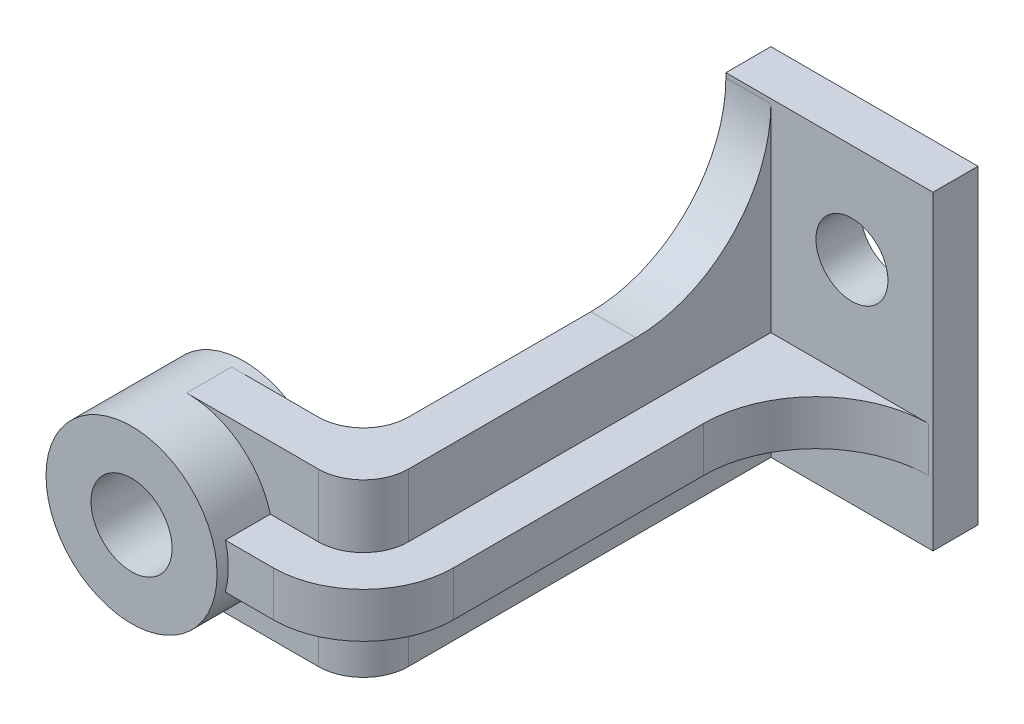
ISO-10303-21;
HEADER;
FILE_DESCRIPTION(('STEP AP214'),'2;1');
FILE_NAME('part.step','',(''),(''),'','','');
FILE_SCHEMA(('AUTOMOTIVE_DESIGN { 1 0 10303 214 1 1 1 1 }'));
ENDSEC;
DATA;
#1=APPLICATION_CONTEXT('core data for automotive mechanical design processes');
#2=APPLICATION_PROTOCOL_DEFINITION('international standard','automotive_design',2000,#1);
#3=PRODUCT_CONTEXT('',#1,'mechanical');
#4=PRODUCT('Part','Part','',(#3));
#5=PRODUCT_RELATED_PRODUCT_CATEGORY('part','',(#4));
#6=PRODUCT_DEFINITION_FORMATION('','',#4);
#7=PRODUCT_DEFINITION_CONTEXT('part definition',#1,'design');
#8=PRODUCT_DEFINITION('design','',#6,#7);
#9=PRODUCT_DEFINITION_SHAPE('','',#8);
#10=(LENGTH_UNIT() NAMED_UNIT(*) SI_UNIT(.MILLI.,.METRE.));
#11=(NAMED_UNIT(*) PLANE_ANGLE_UNIT() SI_UNIT($,.RADIAN.));
#12=(NAMED_UNIT(*) SI_UNIT($,.STERADIAN.) SOLID_ANGLE_UNIT());
#13=UNCERTAINTY_MEASURE_WITH_UNIT(LENGTH_MEASURE(1.E-05),#10,'distance_accuracy_value','');
#14=(GEOMETRIC_REPRESENTATION_CONTEXT(3) GLOBAL_UNCERTAINTY_ASSIGNED_CONTEXT((#13)) GLOBAL_UNIT_ASSIGNED_CONTEXT((#10,
#11,#12)) REPRESENTATION_CONTEXT('',''));
#15=CARTESIAN_POINT('',(0.,0.,0.));
#16=DIRECTION('',(0.,0.,1.));
#17=DIRECTION('',(1.,0.,0.));
#18=AXIS2_PLACEMENT_3D('',#15,#16,#17);
#19=CARTESIAN_POINT('',(-52.2741331242888,-34.5,100.5));
#20=DIRECTION('',(0.,0.,-1.));
#21=DIRECTION('',(-1.,0.,0.));
#22=AXIS2_PLACEMENT_3D('',#19,#20,#21);
#23=PLANE('',#22);
#24=DIRECTION('',(-1.,0.,0.));
#25=VECTOR('',#24,1.);
#26=CARTESIAN_POINT('',(-52.2741331242888,-10.5,100.5));
#27=LINE('',#26,#25);
#28=CARTESIAN_POINT('',(-23.,-10.5,100.5));
#29=VERTEX_POINT('',#28);
#30=CARTESIAN_POINT('',(-33.6696972201766,-10.5,100.5));
#31=VERTEX_POINT('',#30);
#32=EDGE_CURVE('E258',#29,#31,#27,.T.);
#33=ORIENTED_EDGE('',*,*,#32,.F.);
#34=DIRECTION('',(0.,1.,0.));
#35=VECTOR('',#34,1.);
#36=CARTESIAN_POINT('',(-23.,-34.5,100.5));
#37=LINE('',#36,#35);
#38=CARTESIAN_POINT('',(-23.,3.5,100.5));
#39=VERTEX_POINT('',#38);
#40=EDGE_CURVE('E399',#29,#39,#37,.T.);
#41=ORIENTED_EDGE('',*,*,#40,.T.);
#42=DIRECTION('',(-1.,0.,0.));
#43=VECTOR('',#42,1.);
#44=CARTESIAN_POINT('',(-52.2741331242888,3.5,100.5));
#45=LINE('',#44,#43);
#46=CARTESIAN_POINT('',(-52.,3.5,100.5));
#47=VERTEX_POINT('',#46);
#48=EDGE_CURVE('E326',#39,#47,#45,.T.);
#49=ORIENTED_EDGE('',*,*,#48,.T.);
#50=CARTESIAN_POINT('',(-52.,-15.5,100.5));
#51=DIRECTION('',(0.,0.,-1.));
#52=DIRECTION('',(-1.,0.,0.));
#53=AXIS2_PLACEMENT_3D('',#50,#51,#52);
#54=CIRCLE('',#53,19.);
#55=EDGE_CURVE('E294',#31,#47,#54,.F.);
#56=ORIENTED_EDGE('',*,*,#55,.F.);
#57=EDGE_LOOP('',(#33,#41,#49,#56));
#58=FACE_BOUND('',#57,.T.);
#59=ADVANCED_FACE('F39',(#58),#23,.F.);
#60=CARTESIAN_POINT('',(-13.,-34.5,100.5));
#61=DIRECTION('',(-1.,0.,0.));
#62=DIRECTION('',(0.,0.,1.));
#63=AXIS2_PLACEMENT_3D('',#60,#61,#62);
#64=PLANE('',#63);
#65=DIRECTION('',(0.,0.,1.));
#66=VECTOR('',#65,1.);
#67=CARTESIAN_POINT('',(-13.,-10.5,100.5));
#68=LINE('',#67,#66);
#69=CARTESIAN_POINT('',(-13.,-10.5,9.99999999999999));
#70=VERTEX_POINT('',#69);
#71=CARTESIAN_POINT('',(-13.,-10.5,90.5));
#72=VERTEX_POINT('',#71);
#73=EDGE_CURVE('E255',#70,#72,#68,.T.);
#74=ORIENTED_EDGE('',*,*,#73,.F.);
#75=DIRECTION('',(0.,1.,0.));
#76=VECTOR('',#75,1.);
#77=CARTESIAN_POINT('',(-13.,-34.5,10.));
#78=LINE('',#77,#76);
#79=CARTESIAN_POINT('',(-13.,33.5,10.));
#80=VERTEX_POINT('',#79);
#81=EDGE_CURVE('E345',#70,#80,#78,.T.);
#82=ORIENTED_EDGE('',*,*,#81,.T.);
#83=CARTESIAN_POINT('',(-13.,33.5,40.));
#84=DIRECTION('',(-1.,0.,0.));
#85=DIRECTION('',(0.,0.,1.));
#86=AXIS2_PLACEMENT_3D('',#83,#84,#85);
#87=CIRCLE('',#86,30.);
#88=CARTESIAN_POINT('',(-13.,3.5,40.));
#89=VERTEX_POINT('',#88);
#90=EDGE_CURVE('E388',#80,#89,#87,.T.);
#91=ORIENTED_EDGE('',*,*,#90,.T.);
#92=DIRECTION('',(0.,0.,1.));
#93=VECTOR('',#92,1.);
#94=CARTESIAN_POINT('',(-13.,3.5,100.5));
#95=LINE('',#94,#93);
#96=CARTESIAN_POINT('',(-13.,3.5,90.5));
#97=VERTEX_POINT('',#96);
#98=EDGE_CURVE('E308',#89,#97,#95,.T.);
#99=ORIENTED_EDGE('',*,*,#98,.T.);
#100=DIRECTION('',(0.,1.,0.));
#101=VECTOR('',#100,1.);
#102=CARTESIAN_POINT('',(-13.,-34.5,90.5));
#103=LINE('',#102,#101);
#104=EDGE_CURVE('E406',#97,#72,#103,.F.);
#105=ORIENTED_EDGE('',*,*,#104,.T.);
#106=EDGE_LOOP('',(#74,#82,#91,#99,#105));
#107=FACE_BOUND('',#106,.T.);
#108=ADVANCED_FACE('F504',(#107),#64,.F.);
#109=CARTESIAN_POINT('',(-23.,-34.5,90.5));
#110=DIRECTION('',(0.,1.,0.));
#111=DIRECTION('',(0.,0.,1.));
#112=AXIS2_PLACEMENT_3D('',#109,#110,#111);
#113=CYLINDRICAL_SURFACE('',#112,10.);
#114=ORIENTED_EDGE('',*,*,#40,.F.);
#115=CARTESIAN_POINT('',(-23.,-10.5,90.5));
#116=DIRECTION('',(0.,-1.,0.));
#117=DIRECTION('',(0.,0.,-1.));
#118=AXIS2_PLACEMENT_3D('',#115,#116,#117);
#119=CIRCLE('',#118,10.);
#120=EDGE_CURVE('E415',#29,#72,#119,.F.);
#121=ORIENTED_EDGE('',*,*,#120,.T.);
#122=ORIENTED_EDGE('',*,*,#104,.F.);
#123=CARTESIAN_POINT('',(-23.,3.5,90.5));
#124=DIRECTION('',(0.,1.,0.));
#125=DIRECTION('',(0.,0.,1.));
#126=AXIS2_PLACEMENT_3D('',#123,#124,#125);
#127=CIRCLE('',#126,10.);
#128=EDGE_CURVE('E403',#39,#97,#127,.T.);
#129=ORIENTED_EDGE('',*,*,#128,.F.);
#130=EDGE_LOOP('',(#114,#121,#122,#129));
#131=FACE_BOUND('',#130,.T.);
#132=ADVANCED_FACE('F510',(#131),#113,.T.);
#133=CARTESIAN_POINT('',(-23.,-34.5,90.5));
#134=DIRECTION('',(0.,0.,1.));
#135=DIRECTION('',(1.,0.,0.));
#136=AXIS2_PLACEMENT_3D('',#133,#134,#135);
#137=PLANE('',#136);
#138=DIRECTION('',(0.,1.,0.));
#139=VECTOR('',#138,1.);
#140=CARTESIAN_POINT('',(-33.,-34.5,90.5));
#141=LINE('',#140,#139);
#142=CARTESIAN_POINT('',(-33.,3.5,90.5));
#143=VERTEX_POINT('',#142);
#144=CARTESIAN_POINT('',(-33.,-15.5,90.5));
#145=VERTEX_POINT('',#144);
#146=EDGE_CURVE('E396',#143,#145,#141,.F.);
#147=ORIENTED_EDGE('',*,*,#146,.T.);
#148=CARTESIAN_POINT('',(-52.,-15.5,90.5));
#149=DIRECTION('',(0.,0.,1.));
#150=DIRECTION('',(1.,0.,0.));
#151=AXIS2_PLACEMENT_3D('',#148,#149,#150);
#152=CIRCLE('',#151,19.);
#153=CARTESIAN_POINT('',(-52.,3.5,90.5));
#154=VERTEX_POINT('',#153);
#155=EDGE_CURVE('E284',#154,#145,#152,.F.);
#156=ORIENTED_EDGE('',*,*,#155,.F.);
#157=DIRECTION('',(1.,0.,0.));
#158=VECTOR('',#157,1.);
#159=CARTESIAN_POINT('',(-23.,3.5,90.5));
#160=LINE('',#159,#158);
#161=EDGE_CURVE('E332',#154,#143,#160,.T.);
#162=ORIENTED_EDGE('',*,*,#161,.T.);
#163=EDGE_LOOP('',(#147,#156,#162));
#164=FACE_BOUND('',#163,.T.);
#165=ADVANCED_FACE('F524',(#164),#137,.F.);
#166=CARTESIAN_POINT('',(-52.2741331242888,-34.4980222926011,100.5));
#167=VERTEX_POINT('',#166);
#168=CARTESIAN_POINT('',(-52.,-34.5,100.5));
#169=VERTEX_POINT('',#168);
#170=EDGE_CURVE('E293',#167,#169,#54,.F.);
#171=ORIENTED_EDGE('',*,*,#170,.F.);
#172=DIRECTION('',(0.,1.,0.));
#173=VECTOR('',#172,1.);
#174=CARTESIAN_POINT('',(-52.2741331242888,-34.5,100.5));
#175=LINE('',#174,#173);
#176=CARTESIAN_POINT('',(-52.2741331242888,-34.5,100.5));
#177=VERTEX_POINT('',#176);
#178=EDGE_CURVE('E342',#177,#167,#175,.T.);
#179=ORIENTED_EDGE('',*,*,#178,.F.);
#180=DIRECTION('',(-1.,0.,0.));
#181=VECTOR('',#180,1.);
#182=CARTESIAN_POINT('',(-52.2741331242888,-34.5,100.5));
#183=LINE('',#182,#181);
#184=EDGE_CURVE('E312',#169,#177,#183,.T.);
#185=ORIENTED_EDGE('',*,*,#184,.F.);
#186=EDGE_LOOP('',(#171,#179,#185));
#187=FACE_BOUND('',#186,.T.);
#188=ADVANCED_FACE('F459',(#187),#23,.F.);
#189=CARTESIAN_POINT('',(-23.,-34.5,100.5));
#190=VERTEX_POINT('',#189);
#191=CARTESIAN_POINT('',(-23.,-20.5,100.5));
#192=VERTEX_POINT('',#191);
#193=EDGE_CURVE('E400',#190,#192,#37,.T.);
#194=ORIENTED_EDGE('',*,*,#193,.T.);
#195=DIRECTION('',(-1.,0.,0.));
#196=VECTOR('',#195,1.);
#197=CARTESIAN_POINT('',(-52.2741331242888,-20.5,100.5));
#198=LINE('',#197,#196);
#199=CARTESIAN_POINT('',(-33.6696972201766,-20.5,100.5));
#200=VERTEX_POINT('',#199);
#201=EDGE_CURVE('E266',#192,#200,#198,.T.);
#202=ORIENTED_EDGE('',*,*,#201,.T.);
#203=EDGE_CURVE('E303',#169,#200,#54,.F.);
#204=ORIENTED_EDGE('',*,*,#203,.F.);
#205=EDGE_CURVE('E314',#190,#169,#183,.T.);
#206=ORIENTED_EDGE('',*,*,#205,.F.);
#207=EDGE_LOOP('',(#194,#202,#204,#206));
#208=FACE_BOUND('',#207,.T.);
#209=ADVANCED_FACE('F450',(#208),#23,.F.);
#210=CARTESIAN_POINT('',(-52.2741331242888,-34.5,90.5));
#211=DIRECTION('',(1.,0.,0.));
#212=DIRECTION('',(0.,0.,-1.));
#213=AXIS2_PLACEMENT_3D('',#210,#211,#212);
#214=PLANE('',#213);
#215=DIRECTION('',(0.,0.,1.));
#216=VECTOR('',#215,1.);
#217=CARTESIAN_POINT('',(-52.2741331242888,3.49802229260108,88.));
#218=LINE('',#217,#216);
#219=CARTESIAN_POINT('',(-52.2741331242888,3.49802229260107,100.5));
#220=VERTEX_POINT('',#219);
#221=CARTESIAN_POINT('',(-52.2741331242888,3.49802229260108,90.5));
#222=VERTEX_POINT('',#221);
#223=EDGE_CURVE('E295',#220,#222,#218,.F.);
#224=ORIENTED_EDGE('',*,*,#223,.F.);
#225=CARTESIAN_POINT('',(-52.2741331242888,3.5,100.5));
#226=VERTEX_POINT('',#225);
#227=EDGE_CURVE('E340',#220,#226,#175,.T.);
#228=ORIENTED_EDGE('',*,*,#227,.T.);
#229=DIRECTION('',(0.,0.,-1.));
#230=VECTOR('',#229,1.);
#231=CARTESIAN_POINT('',(-52.2741331242888,3.5,90.5));
#232=LINE('',#231,#230);
#233=CARTESIAN_POINT('',(-52.2741331242888,3.5,90.5));
#234=VERTEX_POINT('',#233);
#235=EDGE_CURVE('E329',#226,#234,#232,.T.);
#236=ORIENTED_EDGE('',*,*,#235,.T.);
#237=DIRECTION('',(0.,1.,0.));
#238=VECTOR('',#237,1.);
#239=CARTESIAN_POINT('',(-52.2741331242888,-34.5,90.5));
#240=LINE('',#239,#238);
#241=EDGE_CURVE('E322',#222,#234,#240,.T.);
#242=ORIENTED_EDGE('',*,*,#241,.F.);
#243=EDGE_LOOP('',(#224,#228,#236,#242));
#244=FACE_BOUND('',#243,.T.);
#245=ADVANCED_FACE('F533',(#244),#214,.F.);
#246=DIRECTION('',(0.,0.,1.));
#247=VECTOR('',#246,1.);
#248=CARTESIAN_POINT('',(-52.2741331242888,-34.4980222926011,88.));
#249=LINE('',#248,#247);
#250=CARTESIAN_POINT('',(-52.2741331242888,-34.4980222926011,90.5));
#251=VERTEX_POINT('',#250);
#252=EDGE_CURVE('E287',#251,#167,#249,.T.);
#253=ORIENTED_EDGE('',*,*,#252,.F.);
#254=CARTESIAN_POINT('',(-52.2741331242888,-34.5,90.5));
#255=VERTEX_POINT('',#254);
#256=EDGE_CURVE('E337',#255,#251,#240,.T.);
#257=ORIENTED_EDGE('',*,*,#256,.F.);
#258=DIRECTION('',(0.,0.,-1.));
#259=VECTOR('',#258,1.);
#260=CARTESIAN_POINT('',(-52.2741331242888,-34.5,90.5));
#261=LINE('',#260,#259);
#262=EDGE_CURVE('E316',#177,#255,#261,.T.);
#263=ORIENTED_EDGE('',*,*,#262,.F.);
#264=ORIENTED_EDGE('',*,*,#178,.T.);
#265=EDGE_LOOP('',(#253,#257,#263,#264));
#266=FACE_BOUND('',#265,.T.);
#267=ADVANCED_FACE('F461',(#266),#214,.F.);
#268=CARTESIAN_POINT('',(-52.,-34.5,90.5));
#269=VERTEX_POINT('',#268);
#270=EDGE_CURVE('E286',#269,#251,#152,.F.);
#271=ORIENTED_EDGE('',*,*,#270,.F.);
#272=DIRECTION('',(1.,0.,0.));
#273=VECTOR('',#272,1.);
#274=CARTESIAN_POINT('',(-23.,-34.5,90.5));
#275=LINE('',#274,#273);
#276=EDGE_CURVE('E319',#255,#269,#275,.T.);
#277=ORIENTED_EDGE('',*,*,#276,.F.);
#278=ORIENTED_EDGE('',*,*,#256,.T.);
#279=EDGE_LOOP('',(#271,#277,#278));
#280=FACE_BOUND('',#279,.T.);
#281=ADVANCED_FACE('F466',(#280),#137,.F.);
#282=EDGE_CURVE('E298',#222,#154,#152,.F.);
#283=ORIENTED_EDGE('',*,*,#282,.F.);
#284=ORIENTED_EDGE('',*,*,#241,.T.);
#285=EDGE_CURVE('E333',#234,#154,#160,.T.);
#286=ORIENTED_EDGE('',*,*,#285,.T.);
#287=EDGE_LOOP('',(#283,#284,#286));
#288=FACE_BOUND('',#287,.T.);
#289=ADVANCED_FACE('F530',(#288),#137,.F.);
#290=CARTESIAN_POINT('',(0.,0.,10.));
#291=DIRECTION('',(0.,0.,1.));
#292=DIRECTION('',(1.,0.,0.));
#293=AXIS2_PLACEMENT_3D('',#290,#291,#292);
#294=PLANE('',#293);
#295=CARTESIAN_POINT('',(5.,12.5,10.));
#296=DIRECTION('',(0.,0.,1.));
#297=DIRECTION('',(1.,0.,0.));
#298=AXIS2_PLACEMENT_3D('',#295,#296,#297);
#299=CIRCLE('',#298,8.);
#300=CARTESIAN_POINT('',(13.,12.5,10.));
#301=VERTEX_POINT('',#300);
#302=EDGE_CURVE('E632',#301,#301,#299,.T.);
#303=ORIENTED_EDGE('',*,*,#302,.F.);
#304=EDGE_LOOP('',(#303));
#305=FACE_BOUND('',#304,.T.);
#306=DIRECTION('',(1.,0.,0.));
#307=VECTOR('',#306,1.);
#308=CARTESIAN_POINT('',(0.,-10.5,10.));
#309=LINE('',#308,#307);
#310=CARTESIAN_POINT('',(22.,-10.5,10.));
#311=VERTEX_POINT('',#310);
#312=EDGE_CURVE('E55',#70,#311,#309,.T.);
#313=ORIENTED_EDGE('',*,*,#312,.T.);
#314=DIRECTION('',(0.,-1.,0.));
#315=VECTOR('',#314,1.);
#316=CARTESIAN_POINT('',(22.,-20.5,10.));
#317=LINE('',#316,#315);
#318=CARTESIAN_POINT('',(22.,-20.5,10.));
#319=VERTEX_POINT('',#318);
#320=EDGE_CURVE('E424',#311,#319,#317,.T.);
#321=ORIENTED_EDGE('',*,*,#320,.T.);
#322=DIRECTION('',(1.,0.,0.));
#323=VECTOR('',#322,1.);
#324=CARTESIAN_POINT('',(0.,-20.5,10.));
#325=LINE('',#324,#323);
#326=CARTESIAN_POINT('',(-13.,-20.5,9.99999999999999));
#327=VERTEX_POINT('',#326);
#328=EDGE_CURVE('E62',#327,#319,#325,.T.);
#329=ORIENTED_EDGE('',*,*,#328,.F.);
#330=CARTESIAN_POINT('',(-13.,-34.5,10.));
#331=VERTEX_POINT('',#330);
#332=EDGE_CURVE('E347',#331,#327,#78,.T.);
#333=ORIENTED_EDGE('',*,*,#332,.F.);
#334=DIRECTION('',(1.,0.,0.));
#335=VECTOR('',#334,1.);
#336=CARTESIAN_POINT('',(-23.,-34.5,10.));
#337=LINE('',#336,#335);
#338=CARTESIAN_POINT('',(23.,-34.5,10.));
#339=VERTEX_POINT('',#338);
#340=EDGE_CURVE('E351',#331,#339,#337,.T.);
#341=ORIENTED_EDGE('',*,*,#340,.T.);
#342=DIRECTION('',(0.,1.,0.));
#343=VECTOR('',#342,1.);
#344=CARTESIAN_POINT('',(23.,-34.5,10.));
#345=LINE('',#344,#343);
#346=CARTESIAN_POINT('',(23.,34.5,10.));
#347=VERTEX_POINT('',#346);
#348=EDGE_CURVE('E353',#339,#347,#345,.T.);
#349=ORIENTED_EDGE('',*,*,#348,.T.);
#350=DIRECTION('',(-1.,0.,0.));
#351=VECTOR('',#350,1.);
#352=CARTESIAN_POINT('',(-23.,34.5,10.));
#353=LINE('',#352,#351);
#354=CARTESIAN_POINT('',(-23.,34.5,10.));
#355=VERTEX_POINT('',#354);
#356=EDGE_CURVE('E356',#347,#355,#353,.T.);
#357=ORIENTED_EDGE('',*,*,#356,.T.);
#358=DIRECTION('',(0.,-1.,0.));
#359=VECTOR('',#358,1.);
#360=CARTESIAN_POINT('',(-23.,-34.5,10.));
#361=LINE('',#360,#359);
#362=CARTESIAN_POINT('',(-23.,33.5,10.));
#363=VERTEX_POINT('',#362);
#364=EDGE_CURVE('E358',#355,#363,#361,.T.);
#365=ORIENTED_EDGE('',*,*,#364,.T.);
#366=DIRECTION('',(1.,0.,0.));
#367=VECTOR('',#366,1.);
#368=CARTESIAN_POINT('',(-13.,33.5,10.));
#369=LINE('',#368,#367);
#370=EDGE_CURVE('E382',#363,#80,#369,.T.);
#371=ORIENTED_EDGE('',*,*,#370,.T.);
#372=ORIENTED_EDGE('',*,*,#81,.F.);
#373=EDGE_LOOP('',(#313,#321,#329,#333,#341,#349,#357,#365,#371,#372));
#374=FACE_BOUND('',#373,.T.);
#375=ADVANCED_FACE('F434',(#305,#374),#294,.T.);
#376=CARTESIAN_POINT('',(-23.,-34.5,10.));
#377=DIRECTION('',(0.,1.,0.));
#378=DIRECTION('',(0.,0.,1.));
#379=AXIS2_PLACEMENT_3D('',#376,#377,#378);
#380=PLANE('',#379);
#381=DIRECTION('',(0.,0.,1.));
#382=VECTOR('',#381,1.);
#383=CARTESIAN_POINT('',(-13.,-34.5,100.5));
#384=LINE('',#383,#382);
#385=CARTESIAN_POINT('',(-13.,-34.5,90.5));
#386=VERTEX_POINT('',#385);
#387=EDGE_CURVE('E309',#331,#386,#384,.T.);
#388=ORIENTED_EDGE('',*,*,#387,.T.);
#389=CARTESIAN_POINT('',(-23.,-34.5,90.5));
#390=DIRECTION('',(0.,1.,0.));
#391=DIRECTION('',(0.,0.,1.));
#392=AXIS2_PLACEMENT_3D('',#389,#390,#391);
#393=CIRCLE('',#392,10.);
#394=EDGE_CURVE('E409',#386,#190,#393,.F.);
#395=ORIENTED_EDGE('',*,*,#394,.T.);
#396=ORIENTED_EDGE('',*,*,#205,.T.);
#397=ORIENTED_EDGE('',*,*,#184,.T.);
#398=ORIENTED_EDGE('',*,*,#262,.T.);
#399=ORIENTED_EDGE('',*,*,#276,.T.);
#400=CARTESIAN_POINT('',(-33.,-34.5,90.5));
#401=VERTEX_POINT('',#400);
#402=EDGE_CURVE('E318',#269,#401,#275,.T.);
#403=ORIENTED_EDGE('',*,*,#402,.T.);
#404=CARTESIAN_POINT('',(-33.,-34.5,80.5));
#405=DIRECTION('',(0.,1.,0.));
#406=DIRECTION('',(0.,0.,1.));
#407=AXIS2_PLACEMENT_3D('',#404,#405,#406);
#408=CIRCLE('',#407,10.);
#409=CARTESIAN_POINT('',(-23.,-34.5,80.5));
#410=VERTEX_POINT('',#409);
#411=EDGE_CURVE('E413',#401,#410,#408,.T.);
#412=ORIENTED_EDGE('',*,*,#411,.T.);
#413=DIRECTION('',(0.,0.,-1.));
#414=VECTOR('',#413,1.);
#415=CARTESIAN_POINT('',(-23.,-34.5,10.));
#416=LINE('',#415,#414);
#417=CARTESIAN_POINT('',(-23.,-34.5,0.));
#418=VERTEX_POINT('',#417);
#419=EDGE_CURVE('E361',#410,#418,#416,.T.);
#420=ORIENTED_EDGE('',*,*,#419,.T.);
#421=DIRECTION('',(1.,0.,0.));
#422=VECTOR('',#421,1.);
#423=CARTESIAN_POINT('',(-23.,-34.5,0.));
#424=LINE('',#423,#422);
#425=CARTESIAN_POINT('',(23.,-34.5,0.));
#426=VERTEX_POINT('',#425);
#427=EDGE_CURVE('E350',#418,#426,#424,.T.);
#428=ORIENTED_EDGE('',*,*,#427,.T.);
#429=DIRECTION('',(0.,0.,-1.));
#430=VECTOR('',#429,1.);
#431=CARTESIAN_POINT('',(23.,-34.5,10.));
#432=LINE('',#431,#430);
#433=EDGE_CURVE('E377',#339,#426,#432,.T.);
#434=ORIENTED_EDGE('',*,*,#433,.F.);
#435=ORIENTED_EDGE('',*,*,#340,.F.);
#436=EDGE_LOOP('',(#388,#395,#396,#397,#398,#399,#403,#412,#420,#428,#434,#435));
#437=FACE_BOUND('',#436,.T.);
#438=ADVANCED_FACE('F442',(#437),#380,.F.);
#439=CARTESIAN_POINT('',(23.,-34.5,10.));
#440=DIRECTION('',(-1.,0.,0.));
#441=DIRECTION('',(0.,0.,1.));
#442=AXIS2_PLACEMENT_3D('',#439,#440,#441);
#443=PLANE('',#442);
#444=DIRECTION('',(0.,1.,0.));
#445=VECTOR('',#444,1.);
#446=CARTESIAN_POINT('',(23.,-34.5,0.));
#447=LINE('',#446,#445);
#448=CARTESIAN_POINT('',(23.,34.5,0.));
#449=VERTEX_POINT('',#448);
#450=EDGE_CURVE('E364',#426,#449,#447,.T.);
#451=ORIENTED_EDGE('',*,*,#450,.T.);
#452=DIRECTION('',(0.,0.,-1.));
#453=VECTOR('',#452,1.);
#454=CARTESIAN_POINT('',(23.,34.5,10.));
#455=LINE('',#454,#453);
#456=EDGE_CURVE('E374',#347,#449,#455,.T.);
#457=ORIENTED_EDGE('',*,*,#456,.F.);
#458=ORIENTED_EDGE('',*,*,#348,.F.);
#459=ORIENTED_EDGE('',*,*,#433,.T.);
#460=EDGE_LOOP('',(#451,#457,#458,#459));
#461=FACE_BOUND('',#460,.T.);
#462=ADVANCED_FACE('F491',(#461),#443,.F.);
#463=CARTESIAN_POINT('',(-23.,34.5,10.));
#464=DIRECTION('',(0.,-1.,0.));
#465=DIRECTION('',(0.,0.,-1.));
#466=AXIS2_PLACEMENT_3D('',#463,#464,#465);
#467=PLANE('',#466);
#468=DIRECTION('',(-1.,0.,0.));
#469=VECTOR('',#468,1.);
#470=CARTESIAN_POINT('',(-23.,34.5,0.));
#471=LINE('',#470,#469);
#472=CARTESIAN_POINT('',(-23.,34.5,0.));
#473=VERTEX_POINT('',#472);
#474=EDGE_CURVE('E366',#449,#473,#471,.T.);
#475=ORIENTED_EDGE('',*,*,#474,.T.);
#476=DIRECTION('',(0.,0.,-1.));
#477=VECTOR('',#476,1.);
#478=CARTESIAN_POINT('',(-23.,34.5,10.));
#479=LINE('',#478,#477);
#480=EDGE_CURVE('E371',#355,#473,#479,.T.);
#481=ORIENTED_EDGE('',*,*,#480,.F.);
#482=ORIENTED_EDGE('',*,*,#356,.F.);
#483=ORIENTED_EDGE('',*,*,#456,.T.);
#484=EDGE_LOOP('',(#475,#481,#482,#483));
#485=FACE_BOUND('',#484,.T.);
#486=ADVANCED_FACE('F496',(#485),#467,.F.);
#487=CARTESIAN_POINT('',(-23.,-34.5,10.));
#488=DIRECTION('',(1.,0.,0.));
#489=DIRECTION('',(0.,0.,-1.));
#490=AXIS2_PLACEMENT_3D('',#487,#488,#489);
#491=PLANE('',#490);
#492=DIRECTION('',(0.,1.,0.));
#493=VECTOR('',#492,1.);
#494=CARTESIAN_POINT('',(-23.,3.5,80.5));
#495=LINE('',#494,#493);
#496=CARTESIAN_POINT('',(-23.,3.5,80.5));
#497=VERTEX_POINT('',#496);
#498=EDGE_CURVE('E392',#410,#497,#495,.T.);
#499=ORIENTED_EDGE('',*,*,#498,.T.);
#500=DIRECTION('',(0.,0.,-1.));
#501=VECTOR('',#500,1.);
#502=CARTESIAN_POINT('',(-23.,3.5,10.));
#503=LINE('',#502,#501);
#504=CARTESIAN_POINT('',(-23.,3.5,40.));
#505=VERTEX_POINT('',#504);
#506=EDGE_CURVE('E313',#497,#505,#503,.T.);
#507=ORIENTED_EDGE('',*,*,#506,.T.);
#508=CARTESIAN_POINT('',(-23.,33.5,40.));
#509=DIRECTION('',(1.,0.,0.));
#510=DIRECTION('',(0.,0.,-1.));
#511=AXIS2_PLACEMENT_3D('',#508,#509,#510);
#512=CIRCLE('',#511,30.);
#513=EDGE_CURVE('E390',#505,#363,#512,.T.);
#514=ORIENTED_EDGE('',*,*,#513,.T.);
#515=ORIENTED_EDGE('',*,*,#364,.F.);
#516=ORIENTED_EDGE('',*,*,#480,.T.);
#517=DIRECTION('',(0.,-1.,0.));
#518=VECTOR('',#517,1.);
#519=CARTESIAN_POINT('',(-23.,-34.5,0.));
#520=LINE('',#519,#518);
#521=EDGE_CURVE('E354',#473,#418,#520,.T.);
#522=ORIENTED_EDGE('',*,*,#521,.T.);
#523=ORIENTED_EDGE('',*,*,#419,.F.);
#524=EDGE_LOOP('',(#499,#507,#514,#515,#516,#522,#523));
#525=FACE_BOUND('',#524,.T.);
#526=ADVANCED_FACE('F482',(#525),#491,.F.);
#527=CARTESIAN_POINT('',(0.,0.,0.));
#528=DIRECTION('',(0.,0.,1.));
#529=DIRECTION('',(1.,0.,0.));
#530=AXIS2_PLACEMENT_3D('',#527,#528,#529);
#531=PLANE('',#530);
#532=CARTESIAN_POINT('',(5.,12.5,0.));
#533=DIRECTION('',(0.,0.,1.));
#534=DIRECTION('',(1.,0.,0.));
#535=AXIS2_PLACEMENT_3D('',#532,#533,#534);
#536=CIRCLE('',#535,8.);
#537=CARTESIAN_POINT('',(13.,12.5,0.));
#538=VERTEX_POINT('',#537);
#539=EDGE_CURVE('E43',#538,#538,#536,.T.);
#540=ORIENTED_EDGE('',*,*,#539,.T.);
#541=EDGE_LOOP('',(#540));
#542=FACE_BOUND('',#541,.T.);
#543=ORIENTED_EDGE('',*,*,#427,.F.);
#544=ORIENTED_EDGE('',*,*,#521,.F.);
#545=ORIENTED_EDGE('',*,*,#474,.F.);
#546=ORIENTED_EDGE('',*,*,#450,.F.);
#547=EDGE_LOOP('',(#543,#544,#545,#546));
#548=FACE_BOUND('',#547,.T.);
#549=ADVANCED_FACE('F488',(#542,#548),#531,.F.);
#550=ORIENTED_EDGE('',*,*,#332,.T.);
#551=DIRECTION('',(0.,0.,1.));
#552=VECTOR('',#551,1.);
#553=CARTESIAN_POINT('',(-13.,-20.5,100.5));
#554=LINE('',#553,#552);
#555=CARTESIAN_POINT('',(-13.,-20.5,90.5));
#556=VERTEX_POINT('',#555);
#557=EDGE_CURVE('E262',#327,#556,#554,.T.);
#558=ORIENTED_EDGE('',*,*,#557,.T.);
#559=EDGE_CURVE('E405',#556,#386,#103,.F.);
#560=ORIENTED_EDGE('',*,*,#559,.T.);
#561=ORIENTED_EDGE('',*,*,#387,.F.);
#562=EDGE_LOOP('',(#550,#558,#560,#561));
#563=FACE_BOUND('',#562,.T.);
#564=ADVANCED_FACE('F438',(#563),#64,.F.);
#565=EDGE_CURVE('E290',#47,#220,#54,.F.);
#566=ORIENTED_EDGE('',*,*,#565,.F.);
#567=EDGE_CURVE('E325',#47,#226,#45,.T.);
#568=ORIENTED_EDGE('',*,*,#567,.T.);
#569=ORIENTED_EDGE('',*,*,#227,.F.);
#570=EDGE_LOOP('',(#566,#568,#569));
#571=FACE_BOUND('',#570,.T.);
#572=ADVANCED_FACE('F538',(#571),#23,.F.);
#573=ORIENTED_EDGE('',*,*,#402,.F.);
#574=EDGE_CURVE('E281',#145,#269,#152,.F.);
#575=ORIENTED_EDGE('',*,*,#574,.F.);
#576=DIRECTION('',(0.,1.,0.));
#577=VECTOR('',#576,1.);
#578=CARTESIAN_POINT('',(-33.,-34.5,90.5));
#579=LINE('',#578,#577);
#580=EDGE_CURVE('E394',#145,#401,#579,.F.);
#581=ORIENTED_EDGE('',*,*,#580,.T.);
#582=EDGE_LOOP('',(#573,#575,#581));
#583=FACE_BOUND('',#582,.T.);
#584=ADVANCED_FACE('F472',(#583),#137,.F.);
#585=CARTESIAN_POINT('',(0.,3.5,0.));
#586=DIRECTION('',(0.,1.,0.));
#587=DIRECTION('',(0.,0.,1.));
#588=AXIS2_PLACEMENT_3D('',#585,#586,#587);
#589=PLANE('',#588);
#590=ORIENTED_EDGE('',*,*,#48,.F.);
#591=ORIENTED_EDGE('',*,*,#128,.T.);
#592=ORIENTED_EDGE('',*,*,#98,.F.);
#593=DIRECTION('',(1.,0.,0.));
#594=VECTOR('',#593,1.);
#595=CARTESIAN_POINT('',(-23.,3.5,40.));
#596=LINE('',#595,#594);
#597=EDGE_CURVE('E385',#89,#505,#596,.F.);
#598=ORIENTED_EDGE('',*,*,#597,.T.);
#599=ORIENTED_EDGE('',*,*,#506,.F.);
#600=CARTESIAN_POINT('',(-33.,3.5,80.5));
#601=DIRECTION('',(0.,1.,0.));
#602=DIRECTION('',(0.,0.,1.));
#603=AXIS2_PLACEMENT_3D('',#600,#601,#602);
#604=CIRCLE('',#603,10.);
#605=EDGE_CURVE('E411',#497,#143,#604,.F.);
#606=ORIENTED_EDGE('',*,*,#605,.T.);
#607=ORIENTED_EDGE('',*,*,#161,.F.);
#608=ORIENTED_EDGE('',*,*,#285,.F.);
#609=ORIENTED_EDGE('',*,*,#235,.F.);
#610=ORIENTED_EDGE('',*,*,#567,.F.);
#611=EDGE_LOOP('',(#590,#591,#592,#598,#599,#606,#607,#608,#609,#610));
#612=FACE_BOUND('',#611,.T.);
#613=ADVANCED_FACE('F527',(#612),#589,.T.);
#614=CARTESIAN_POINT('',(-52.,-15.5,88.));
#615=DIRECTION('',(0.,0.,1.));
#616=DIRECTION('',(1.,0.,0.));
#617=AXIS2_PLACEMENT_3D('',#614,#615,#616);
#618=CYLINDRICAL_SURFACE('',#617,9.);
#619=DIRECTION('',(0.,0.,1.));
#620=VECTOR('',#619,1.);
#621=CARTESIAN_POINT('',(-52.2741331242888,-24.4958240884406,88.));
#622=LINE('',#621,#620);
#623=CARTESIAN_POINT('',(-52.2741331242888,-24.4958240884406,90.5));
#624=VERTEX_POINT('',#623);
#625=CARTESIAN_POINT('',(-52.2741331242888,-24.4958240884406,100.5));
#626=VERTEX_POINT('',#625);
#627=EDGE_CURVE('E299',#624,#626,#622,.T.);
#628=ORIENTED_EDGE('',*,*,#627,.F.);
#629=CARTESIAN_POINT('',(-52.,-15.5,90.5));
#630=DIRECTION('',(0.,0.,1.));
#631=DIRECTION('',(1.,0.,0.));
#632=AXIS2_PLACEMENT_3D('',#629,#630,#631);
#633=CIRCLE('',#632,9.);
#634=CARTESIAN_POINT('',(-52.2741331242888,-6.50417591155943,90.5));
#635=VERTEX_POINT('',#634);
#636=EDGE_CURVE('E380',#635,#624,#633,.F.);
#637=ORIENTED_EDGE('',*,*,#636,.F.);
#638=DIRECTION('',(0.,0.,1.));
#639=VECTOR('',#638,1.);
#640=CARTESIAN_POINT('',(-52.2741331242888,-6.50417591155943,88.));
#641=LINE('',#640,#639);
#642=CARTESIAN_POINT('',(-52.2741331242888,-6.50417591155943,100.5));
#643=VERTEX_POINT('',#642);
#644=EDGE_CURVE('E302',#643,#635,#641,.F.);
#645=ORIENTED_EDGE('',*,*,#644,.F.);
#646=CARTESIAN_POINT('',(-52.,-15.5,100.5));
#647=DIRECTION('',(0.,0.,-1.));
#648=DIRECTION('',(-1.,0.,0.));
#649=AXIS2_PLACEMENT_3D('',#646,#647,#648);
#650=CIRCLE('',#649,9.);
#651=EDGE_CURVE('E306',#626,#643,#650,.F.);
#652=ORIENTED_EDGE('',*,*,#651,.F.);
#653=EDGE_LOOP('',(#628,#637,#645,#652));
#654=FACE_BOUND('',#653,.T.);
#655=CARTESIAN_POINT('',(-52.,-15.5,88.));
#656=DIRECTION('',(0.,0.,-1.));
#657=DIRECTION('',(-1.,0.,0.));
#658=AXIS2_PLACEMENT_3D('',#655,#656,#657);
#659=CIRCLE('',#658,9.);
#660=CARTESIAN_POINT('',(-61.,-15.5,88.));
#661=VERTEX_POINT('',#660);
#662=EDGE_CURVE('E272',#661,#661,#659,.T.);
#663=ORIENTED_EDGE('',*,*,#662,.T.);
#664=EDGE_LOOP('',(#663));
#665=FACE_BOUND('',#664,.T.);
#666=CARTESIAN_POINT('',(-52.,-15.5,113.));
#667=DIRECTION('',(0.,0.,-1.));
#668=DIRECTION('',(-1.,0.,0.));
#669=AXIS2_PLACEMENT_3D('',#666,#667,#668);
#670=CIRCLE('',#669,9.);
#671=CARTESIAN_POINT('',(-61.,-15.5,113.));
#672=VERTEX_POINT('',#671);
#673=EDGE_CURVE('E271',#672,#672,#670,.T.);
#674=ORIENTED_EDGE('',*,*,#673,.F.);
#675=EDGE_LOOP('',(#674));
#676=FACE_BOUND('',#675,.T.);
#677=ADVANCED_FACE('F549',(#654,#665,#676),#618,.F.);
#678=CARTESIAN_POINT('',(-52.,-15.5,88.));
#679=DIRECTION('',(0.,0.,1.));
#680=DIRECTION('',(1.,0.,0.));
#681=AXIS2_PLACEMENT_3D('',#678,#679,#680);
#682=CYLINDRICAL_SURFACE('',#681,19.);
#683=ORIENTED_EDGE('',*,*,#574,.T.);
#684=ORIENTED_EDGE('',*,*,#270,.T.);
#685=ORIENTED_EDGE('',*,*,#252,.T.);
#686=ORIENTED_EDGE('',*,*,#170,.T.);
#687=ORIENTED_EDGE('',*,*,#203,.T.);
#688=DIRECTION('',(0.,0.,1.));
#689=VECTOR('',#688,1.);
#690=CARTESIAN_POINT('',(-33.6696972201766,-20.5,88.));
#691=LINE('',#690,#689);
#692=CARTESIAN_POINT('',(-33.6696972201766,-20.5,110.5));
#693=VERTEX_POINT('',#692);
#694=EDGE_CURVE('E269',#200,#693,#691,.T.);
#695=ORIENTED_EDGE('',*,*,#694,.T.);
#696=CARTESIAN_POINT('',(-52.,-15.5,110.5));
#697=DIRECTION('',(0.,0.,-1.));
#698=DIRECTION('',(-1.,0.,0.));
#699=AXIS2_PLACEMENT_3D('',#696,#697,#698);
#700=CIRCLE('',#699,19.);
#701=CARTESIAN_POINT('',(-33.6696972201766,-10.5,110.5));
#702=VERTEX_POINT('',#701);
#703=EDGE_CURVE('E228',#693,#702,#700,.F.);
#704=ORIENTED_EDGE('',*,*,#703,.T.);
#705=DIRECTION('',(0.,0.,1.));
#706=VECTOR('',#705,1.);
#707=CARTESIAN_POINT('',(-33.6696972201766,-10.5,88.));
#708=LINE('',#707,#706);
#709=EDGE_CURVE('E260',#31,#702,#708,.T.);
#710=ORIENTED_EDGE('',*,*,#709,.F.);
#711=ORIENTED_EDGE('',*,*,#55,.T.);
#712=ORIENTED_EDGE('',*,*,#565,.T.);
#713=ORIENTED_EDGE('',*,*,#223,.T.);
#714=ORIENTED_EDGE('',*,*,#282,.T.);
#715=ORIENTED_EDGE('',*,*,#155,.T.);
#716=EDGE_LOOP('',(#683,#684,#685,#686,#687,#695,#704,#710,#711,#712,#713,#714,#715));
#717=FACE_BOUND('',#716,.T.);
#718=CARTESIAN_POINT('',(-52.,-15.5,88.));
#719=DIRECTION('',(0.,0.,-1.));
#720=DIRECTION('',(-1.,0.,0.));
#721=AXIS2_PLACEMENT_3D('',#718,#719,#720);
#722=CIRCLE('',#721,19.);
#723=CARTESIAN_POINT('',(-71.,-15.5,88.));
#724=VERTEX_POINT('',#723);
#725=EDGE_CURVE('E278',#724,#724,#722,.T.);
#726=ORIENTED_EDGE('',*,*,#725,.F.);
#727=EDGE_LOOP('',(#726));
#728=FACE_BOUND('',#727,.T.);
#729=CARTESIAN_POINT('',(-52.,-15.5,113.));
#730=DIRECTION('',(0.,0.,-1.));
#731=DIRECTION('',(-1.,0.,0.));
#732=AXIS2_PLACEMENT_3D('',#729,#730,#731);
#733=CIRCLE('',#732,19.);
#734=CARTESIAN_POINT('',(-71.,-15.5,113.));
#735=VERTEX_POINT('',#734);
#736=EDGE_CURVE('E275',#735,#735,#733,.T.);
#737=ORIENTED_EDGE('',*,*,#736,.T.);
#738=EDGE_LOOP('',(#737));
#739=FACE_BOUND('',#738,.T.);
#740=ADVANCED_FACE('F518',(#717,#728,#739),#682,.T.);
#741=CARTESIAN_POINT('',(-52.,-15.5,88.));
#742=DIRECTION('',(0.,0.,-1.));
#743=DIRECTION('',(-1.,0.,0.));
#744=AXIS2_PLACEMENT_3D('',#741,#742,#743);
#745=PLANE('',#744);
#746=ORIENTED_EDGE('',*,*,#662,.F.);
#747=EDGE_LOOP('',(#746));
#748=FACE_BOUND('',#747,.T.);
#749=ORIENTED_EDGE('',*,*,#725,.T.);
#750=EDGE_LOOP('',(#749));
#751=FACE_BOUND('',#750,.T.);
#752=ADVANCED_FACE('F563',(#748,#751),#745,.T.);
#753=CARTESIAN_POINT('',(-52.,-15.5,113.));
#754=DIRECTION('',(0.,0.,-1.));
#755=DIRECTION('',(-1.,0.,0.));
#756=AXIS2_PLACEMENT_3D('',#753,#754,#755);
#757=PLANE('',#756);
#758=ORIENTED_EDGE('',*,*,#736,.F.);
#759=EDGE_LOOP('',(#758));
#760=FACE_BOUND('',#759,.T.);
#761=ORIENTED_EDGE('',*,*,#673,.T.);
#762=EDGE_LOOP('',(#761));
#763=FACE_BOUND('',#762,.T.);
#764=ADVANCED_FACE('F554',(#760,#763),#757,.F.);
#765=EDGE_CURVE('E341',#624,#635,#240,.T.);
#766=ORIENTED_EDGE('',*,*,#765,.T.);
#767=ORIENTED_EDGE('',*,*,#636,.T.);
#768=EDGE_LOOP('',(#766,#767));
#769=FACE_BOUND('',#768,.T.);
#770=ADVANCED_FACE('F552',(#769),#137,.F.);
#771=EDGE_CURVE('E346',#626,#643,#175,.T.);
#772=ORIENTED_EDGE('',*,*,#771,.T.);
#773=ORIENTED_EDGE('',*,*,#644,.T.);
#774=ORIENTED_EDGE('',*,*,#765,.F.);
#775=ORIENTED_EDGE('',*,*,#627,.T.);
#776=EDGE_LOOP('',(#772,#773,#774,#775));
#777=FACE_BOUND('',#776,.T.);
#778=ADVANCED_FACE('F543',(#777),#214,.F.);
#779=ORIENTED_EDGE('',*,*,#651,.T.);
#780=ORIENTED_EDGE('',*,*,#771,.F.);
#781=EDGE_LOOP('',(#779,#780));
#782=FACE_BOUND('',#781,.T.);
#783=ADVANCED_FACE('F560',(#782),#23,.F.);
#784=CARTESIAN_POINT('',(0.,33.5,40.));
#785=DIRECTION('',(-1.,0.,0.));
#786=DIRECTION('',(0.,0.,1.));
#787=AXIS2_PLACEMENT_3D('',#784,#785,#786);
#788=CYLINDRICAL_SURFACE('',#787,30.);
#789=ORIENTED_EDGE('',*,*,#513,.F.);
#790=ORIENTED_EDGE('',*,*,#597,.F.);
#791=ORIENTED_EDGE('',*,*,#90,.F.);
#792=ORIENTED_EDGE('',*,*,#370,.F.);
#793=EDGE_LOOP('',(#789,#790,#791,#792));
#794=FACE_BOUND('',#793,.T.);
#795=ADVANCED_FACE('F501',(#794),#788,.F.);
#796=CARTESIAN_POINT('',(-33.,-34.5,80.5));
#797=DIRECTION('',(0.,-1.,0.));
#798=DIRECTION('',(0.,0.,-1.));
#799=AXIS2_PLACEMENT_3D('',#796,#797,#798);
#800=CYLINDRICAL_SURFACE('',#799,10.);
#801=ORIENTED_EDGE('',*,*,#411,.F.);
#802=ORIENTED_EDGE('',*,*,#580,.F.);
#803=ORIENTED_EDGE('',*,*,#146,.F.);
#804=ORIENTED_EDGE('',*,*,#605,.F.);
#805=ORIENTED_EDGE('',*,*,#498,.F.);
#806=EDGE_LOOP('',(#801,#802,#803,#804,#805));
#807=FACE_BOUND('',#806,.T.);
#808=ADVANCED_FACE('F476',(#807),#800,.F.);
#809=CARTESIAN_POINT('',(-23.,-20.5,90.5));
#810=DIRECTION('',(0.,-1.,0.));
#811=DIRECTION('',(0.,0.,-1.));
#812=AXIS2_PLACEMENT_3D('',#809,#810,#811);
#813=CIRCLE('',#812,10.);
#814=EDGE_CURVE('E418',#192,#556,#813,.F.);
#815=ORIENTED_EDGE('',*,*,#814,.F.);
#816=ORIENTED_EDGE('',*,*,#193,.F.);
#817=ORIENTED_EDGE('',*,*,#394,.F.);
#818=ORIENTED_EDGE('',*,*,#559,.F.);
#819=EDGE_LOOP('',(#815,#816,#817,#818));
#820=FACE_BOUND('',#819,.T.);
#821=ADVANCED_FACE('F448',(#820),#113,.T.);
#822=CARTESIAN_POINT('',(-33.,-15.5,110.5));
#823=DIRECTION('',(0.,0.,-1.));
#824=DIRECTION('',(1.,0.,0.));
#825=AXIS2_PLACEMENT_3D('',#822,#823,#824);
#826=PLANE('',#825);
#827=ORIENTED_EDGE('',*,*,#703,.F.);
#828=DIRECTION('',(1.,0.,0.));
#829=VECTOR('',#828,1.);
#830=CARTESIAN_POINT('',(-24.,-20.5,110.5));
#831=LINE('',#830,#829);
#832=CARTESIAN_POINT('',(-23.,-20.5,110.5));
#833=VERTEX_POINT('',#832);
#834=EDGE_CURVE('E221',#693,#833,#831,.T.);
#835=ORIENTED_EDGE('',*,*,#834,.T.);
#836=DIRECTION('',(0.,-1.,0.));
#837=VECTOR('',#836,1.);
#838=CARTESIAN_POINT('',(-23.,-15.5,110.5));
#839=LINE('',#838,#837);
#840=CARTESIAN_POINT('',(-23.,-10.5,110.5));
#841=VERTEX_POINT('',#840);
#842=EDGE_CURVE('E225',#841,#833,#839,.T.);
#843=ORIENTED_EDGE('',*,*,#842,.F.);
#844=DIRECTION('',(1.,0.,0.));
#845=VECTOR('',#844,1.);
#846=CARTESIAN_POINT('',(-24.,-10.5,110.5));
#847=LINE('',#846,#845);
#848=EDGE_CURVE('E245',#702,#841,#847,.T.);
#849=ORIENTED_EDGE('',*,*,#848,.F.);
#850=EDGE_LOOP('',(#827,#835,#843,#849));
#851=FACE_BOUND('',#850,.T.);
#852=ADVANCED_FACE('F223',(#851),#826,.F.);
#853=CARTESIAN_POINT('',(-24.,-20.5,56.5));
#854=DIRECTION('',(0.,-1.,0.));
#855=DIRECTION('',(0.,0.,-1.));
#856=AXIS2_PLACEMENT_3D('',#853,#854,#855);
#857=PLANE('',#856);
#858=ORIENTED_EDGE('',*,*,#694,.F.);
#859=ORIENTED_EDGE('',*,*,#201,.F.);
#860=ORIENTED_EDGE('',*,*,#814,.T.);
#861=ORIENTED_EDGE('',*,*,#557,.F.);
#862=ORIENTED_EDGE('',*,*,#328,.T.);
#863=CARTESIAN_POINT('',(22.,-20.5,35.));
#864=DIRECTION('',(0.,-1.,0.));
#865=DIRECTION('',(0.,0.,-1.));
#866=AXIS2_PLACEMENT_3D('',#863,#864,#865);
#867=CIRCLE('',#866,25.);
#868=CARTESIAN_POINT('',(-3.,-20.5,35.));
#869=VERTEX_POINT('',#868);
#870=EDGE_CURVE('E11',#319,#869,#867,.F.);
#871=ORIENTED_EDGE('',*,*,#870,.T.);
#872=DIRECTION('',(0.,0.,-1.));
#873=VECTOR('',#872,1.);
#874=CARTESIAN_POINT('',(-3.,-20.5,56.5));
#875=LINE('',#874,#873);
#876=CARTESIAN_POINT('',(-3.,-20.5,90.5));
#877=VERTEX_POINT('',#876);
#878=EDGE_CURVE('E243',#877,#869,#875,.T.);
#879=ORIENTED_EDGE('',*,*,#878,.F.);
#880=CARTESIAN_POINT('',(-23.,-20.5,90.5));
#881=DIRECTION('',(0.,1.,0.));
#882=DIRECTION('',(0.,0.,1.));
#883=AXIS2_PLACEMENT_3D('',#880,#881,#882);
#884=CIRCLE('',#883,20.);
#885=EDGE_CURVE('E231',#833,#877,#884,.T.);
#886=ORIENTED_EDGE('',*,*,#885,.F.);
#887=ORIENTED_EDGE('',*,*,#834,.F.);
#888=EDGE_LOOP('',(#858,#859,#860,#861,#862,#871,#879,#886,#887));
#889=FACE_BOUND('',#888,.T.);
#890=ADVANCED_FACE('F241',(#889),#857,.T.);
#891=CARTESIAN_POINT('',(-24.,-10.5,56.5));
#892=DIRECTION('',(0.,-1.,0.));
#893=DIRECTION('',(0.,0.,-1.));
#894=AXIS2_PLACEMENT_3D('',#891,#892,#893);
#895=PLANE('',#894);
#896=ORIENTED_EDGE('',*,*,#32,.T.);
#897=ORIENTED_EDGE('',*,*,#709,.T.);
#898=ORIENTED_EDGE('',*,*,#848,.T.);
#899=CARTESIAN_POINT('',(-23.,-10.5,90.5));
#900=DIRECTION('',(0.,1.,0.));
#901=DIRECTION('',(0.,0.,1.));
#902=AXIS2_PLACEMENT_3D('',#899,#900,#901);
#903=CIRCLE('',#902,20.);
#904=CARTESIAN_POINT('',(-3.,-10.5,90.5));
#905=VERTEX_POINT('',#904);
#906=EDGE_CURVE('E237',#841,#905,#903,.T.);
#907=ORIENTED_EDGE('',*,*,#906,.T.);
#908=DIRECTION('',(0.,0.,-1.));
#909=VECTOR('',#908,1.);
#910=CARTESIAN_POINT('',(-3.,-10.5,56.5));
#911=LINE('',#910,#909);
#912=CARTESIAN_POINT('',(-3.,-10.5,35.));
#913=VERTEX_POINT('',#912);
#914=EDGE_CURVE('E251',#905,#913,#911,.T.);
#915=ORIENTED_EDGE('',*,*,#914,.T.);
#916=CARTESIAN_POINT('',(22.,-10.5,35.));
#917=DIRECTION('',(0.,-1.,0.));
#918=DIRECTION('',(0.,0.,-1.));
#919=AXIS2_PLACEMENT_3D('',#916,#917,#918);
#920=CIRCLE('',#919,25.);
#921=EDGE_CURVE('E48',#913,#311,#920,.T.);
#922=ORIENTED_EDGE('',*,*,#921,.T.);
#923=ORIENTED_EDGE('',*,*,#312,.F.);
#924=ORIENTED_EDGE('',*,*,#73,.T.);
#925=ORIENTED_EDGE('',*,*,#120,.F.);
#926=EDGE_LOOP('',(#896,#897,#898,#907,#915,#922,#923,#924,#925));
#927=FACE_BOUND('',#926,.T.);
#928=ADVANCED_FACE('F428',(#927),#895,.F.);
#929=CARTESIAN_POINT('',(-3.,-15.5,90.5));
#930=DIRECTION('',(-1.,0.,0.));
#931=DIRECTION('',(0.,0.,-1.));
#932=AXIS2_PLACEMENT_3D('',#929,#930,#931);
#933=PLANE('',#932);
#934=ORIENTED_EDGE('',*,*,#878,.T.);
#935=DIRECTION('',(0.,1.,0.));
#936=VECTOR('',#935,1.);
#937=CARTESIAN_POINT('',(-3.,-10.5,35.));
#938=LINE('',#937,#936);
#939=EDGE_CURVE('E421',#869,#913,#938,.T.);
#940=ORIENTED_EDGE('',*,*,#939,.T.);
#941=ORIENTED_EDGE('',*,*,#914,.F.);
#942=DIRECTION('',(0.,-1.,0.));
#943=VECTOR('',#942,1.);
#944=CARTESIAN_POINT('',(-3.,-15.5,90.5));
#945=LINE('',#944,#943);
#946=EDGE_CURVE('E238',#905,#877,#945,.T.);
#947=ORIENTED_EDGE('',*,*,#946,.T.);
#948=EDGE_LOOP('',(#934,#940,#941,#947));
#949=FACE_BOUND('',#948,.T.);
#950=ADVANCED_FACE('F646',(#949),#933,.F.);
#951=CARTESIAN_POINT('',(-23.,-15.5,90.5));
#952=DIRECTION('',(0.,1.,0.));
#953=DIRECTION('',(0.,0.,1.));
#954=AXIS2_PLACEMENT_3D('',#951,#952,#953);
#955=CYLINDRICAL_SURFACE('',#954,20.);
#956=ORIENTED_EDGE('',*,*,#946,.F.);
#957=ORIENTED_EDGE('',*,*,#906,.F.);
#958=ORIENTED_EDGE('',*,*,#842,.T.);
#959=ORIENTED_EDGE('',*,*,#885,.T.);
#960=EDGE_LOOP('',(#956,#957,#958,#959));
#961=FACE_BOUND('',#960,.T.);
#962=ADVANCED_FACE('F235',(#961),#955,.T.);
#963=CARTESIAN_POINT('',(22.,-15.5,35.));
#964=DIRECTION('',(0.,1.,0.));
#965=DIRECTION('',(0.,0.,1.));
#966=AXIS2_PLACEMENT_3D('',#963,#964,#965);
#967=CYLINDRICAL_SURFACE('',#966,25.);
#968=ORIENTED_EDGE('',*,*,#870,.F.);
#969=ORIENTED_EDGE('',*,*,#320,.F.);
#970=ORIENTED_EDGE('',*,*,#921,.F.);
#971=ORIENTED_EDGE('',*,*,#939,.F.);
#972=EDGE_LOOP('',(#968,#969,#970,#971));
#973=FACE_BOUND('',#972,.T.);
#974=ADVANCED_FACE('F41',(#973),#967,.F.);
#975=CARTESIAN_POINT('',(5.,12.5,-28.));
#976=DIRECTION('',(0.,0.,1.));
#977=DIRECTION('',(1.,0.,0.));
#978=AXIS2_PLACEMENT_3D('',#975,#976,#977);
#979=CYLINDRICAL_SURFACE('',#978,8.);
#980=ORIENTED_EDGE('',*,*,#302,.T.);
#981=EDGE_LOOP('',(#980));
#982=FACE_BOUND('',#981,.T.);
#983=ORIENTED_EDGE('',*,*,#539,.F.);
#984=EDGE_LOOP('',(#983));
#985=FACE_BOUND('',#984,.T.);
#986=ADVANCED_FACE('F637',(#982,#985),#979,.F.);
#987=CLOSED_SHELL('',(#59,#108,#132,#165,#188,#209,#245,#267,#281,#289,#375,#438,#462,#486,#526,
#549,#564,#572,#584,#613,#677,#740,#752,#764,#770,#778,#783,#795,#808,#821,#852,#890,#928,#950,
#962,#974,#986));
#988=MANIFOLD_SOLID_BREP('B2',#987);
#989=ADVANCED_BREP_SHAPE_REPRESENTATION('',(#18,#988),#14);
#990=SHAPE_DEFINITION_REPRESENTATION(#9,#989);
ENDSEC;
END-ISO-10303-21;
